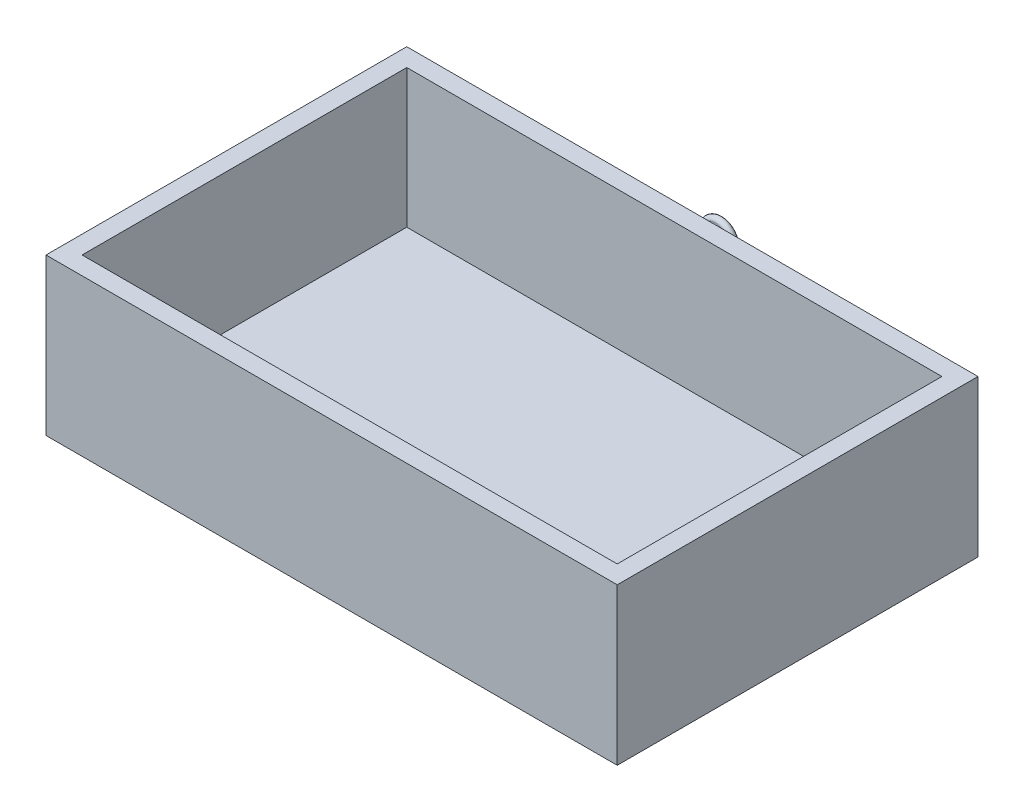
ISO-10303-21;
HEADER;
FILE_DESCRIPTION(('STEP AP214'),'2;1');
FILE_NAME('part.step','',(''),(''),'','','');
FILE_SCHEMA(('AUTOMOTIVE_DESIGN { 1 0 10303 214 1 1 1 1 }'));
ENDSEC;
DATA;
#1=APPLICATION_CONTEXT('core data for automotive mechanical design processes');
#2=APPLICATION_PROTOCOL_DEFINITION('international standard','automotive_design',2000,#1);
#3=PRODUCT_CONTEXT('',#1,'mechanical');
#4=PRODUCT('Part','Part','',(#3));
#5=PRODUCT_RELATED_PRODUCT_CATEGORY('part','',(#4));
#6=PRODUCT_DEFINITION_FORMATION('','',#4);
#7=PRODUCT_DEFINITION_CONTEXT('part definition',#1,'design');
#8=PRODUCT_DEFINITION('design','',#6,#7);
#9=PRODUCT_DEFINITION_SHAPE('','',#8);
#10=(LENGTH_UNIT() NAMED_UNIT(*) SI_UNIT(.MILLI.,.METRE.));
#11=(NAMED_UNIT(*) PLANE_ANGLE_UNIT() SI_UNIT($,.RADIAN.));
#12=(NAMED_UNIT(*) SI_UNIT($,.STERADIAN.) SOLID_ANGLE_UNIT());
#13=UNCERTAINTY_MEASURE_WITH_UNIT(LENGTH_MEASURE(1.E-05),#10,'distance_accuracy_value','');
#14=(GEOMETRIC_REPRESENTATION_CONTEXT(3) GLOBAL_UNCERTAINTY_ASSIGNED_CONTEXT((#13)) GLOBAL_UNIT_ASSIGNED_CONTEXT((#10,
#11,#12)) REPRESENTATION_CONTEXT('',''));
#15=CARTESIAN_POINT('',(0.,0.,0.));
#16=DIRECTION('',(0.,0.,1.));
#17=DIRECTION('',(1.,0.,0.));
#18=AXIS2_PLACEMENT_3D('',#15,#16,#17);
#19=CARTESIAN_POINT('',(-50.5555555555555,119.744444444445,300.));
#20=DIRECTION('',(0.,-1.,0.));
#21=DIRECTION('',(0.,0.,-1.));
#22=AXIS2_PLACEMENT_3D('',#19,#20,#21);
#23=PLANE('',#22);
#24=DIRECTION('',(-1.,0.,0.));
#25=VECTOR('',#24,1.);
#26=CARTESIAN_POINT('',(-50.5555555555555,119.744444444445,0.));
#27=LINE('',#26,#25);
#28=CARTESIAN_POINT('',(424.444444444444,119.744444444445,0.));
#29=VERTEX_POINT('',#28);
#30=CARTESIAN_POINT('',(-50.5555555555555,119.744444444445,0.));
#31=VERTEX_POINT('',#30);
#32=EDGE_CURVE('E85',#29,#31,#27,.T.);
#33=ORIENTED_EDGE('',*,*,#32,.T.);
#34=DIRECTION('',(0.,0.,-1.));
#35=VECTOR('',#34,1.);
#36=CARTESIAN_POINT('',(-50.5555555555555,119.744444444445,300.));
#37=LINE('',#36,#35);
#38=CARTESIAN_POINT('',(-50.5555555555555,119.744444444445,300.));
#39=VERTEX_POINT('',#38);
#40=EDGE_CURVE('E170',#39,#31,#37,.T.);
#41=ORIENTED_EDGE('',*,*,#40,.F.);
#42=DIRECTION('',(-1.,0.,0.));
#43=VECTOR('',#42,1.);
#44=CARTESIAN_POINT('',(-50.5555555555555,119.744444444445,300.));
#45=LINE('',#44,#43);
#46=CARTESIAN_POINT('',(424.444444444444,119.744444444445,300.));
#47=VERTEX_POINT('',#46);
#48=EDGE_CURVE('E64',#47,#39,#45,.T.);
#49=ORIENTED_EDGE('',*,*,#48,.F.);
#50=DIRECTION('',(0.,0.,-1.));
#51=VECTOR('',#50,1.);
#52=CARTESIAN_POINT('',(424.444444444444,119.744444444445,300.));
#53=LINE('',#52,#51);
#54=EDGE_CURVE('E185',#47,#29,#53,.T.);
#55=ORIENTED_EDGE('',*,*,#54,.T.);
#56=EDGE_LOOP('',(#33,#41,#49,#55));
#57=FACE_BOUND('',#56,.T.);
#58=DIRECTION('',(-1.,0.,0.));
#59=VECTOR('',#58,1.);
#60=CARTESIAN_POINT('',(0.,119.744444444445,15.));
#61=LINE('',#60,#59);
#62=CARTESIAN_POINT('',(409.444444444444,119.744444444445,15.));
#63=VERTEX_POINT('',#62);
#64=CARTESIAN_POINT('',(-35.5555555555555,119.744444444445,15.));
#65=VERTEX_POINT('',#64);
#66=EDGE_CURVE('E142',#63,#65,#61,.T.);
#67=ORIENTED_EDGE('',*,*,#66,.F.);
#68=DIRECTION('',(0.,0.,-1.));
#69=VECTOR('',#68,1.);
#70=CARTESIAN_POINT('',(409.444444444444,119.744444444445,300.));
#71=LINE('',#70,#69);
#72=CARTESIAN_POINT('',(409.444444444444,119.744444444445,285.));
#73=VERTEX_POINT('',#72);
#74=EDGE_CURVE('E136',#73,#63,#71,.T.);
#75=ORIENTED_EDGE('',*,*,#74,.F.);
#76=DIRECTION('',(-1.,0.,0.));
#77=VECTOR('',#76,1.);
#78=CARTESIAN_POINT('',(0.,119.744444444445,285.));
#79=LINE('',#78,#77);
#80=CARTESIAN_POINT('',(-35.5555555555555,119.744444444445,285.));
#81=VERTEX_POINT('',#80);
#82=EDGE_CURVE('E55',#73,#81,#79,.T.);
#83=ORIENTED_EDGE('',*,*,#82,.T.);
#84=DIRECTION('',(0.,0.,-1.));
#85=VECTOR('',#84,1.);
#86=CARTESIAN_POINT('',(-35.5555555555555,119.744444444444,300.));
#87=LINE('',#86,#85);
#88=EDGE_CURVE('E152',#81,#65,#87,.T.);
#89=ORIENTED_EDGE('',*,*,#88,.T.);
#90=EDGE_LOOP('',(#67,#75,#83,#89));
#91=FACE_BOUND('',#90,.T.);
#92=ADVANCED_FACE('F39',(#57,#91),#23,.F.);
#93=CARTESIAN_POINT('',(-50.5555555555555,-10.2555555555556,300.));
#94=DIRECTION('',(1.,0.,0.));
#95=DIRECTION('',(0.,1.,0.));
#96=AXIS2_PLACEMENT_3D('',#93,#94,#95);
#97=PLANE('',#96);
#98=DIRECTION('',(0.,-1.,0.));
#99=VECTOR('',#98,1.);
#100=CARTESIAN_POINT('',(-50.5555555555555,-10.2555555555556,0.));
#101=LINE('',#100,#99);
#102=CARTESIAN_POINT('',(-50.5555555555555,-10.2555555555556,0.));
#103=VERTEX_POINT('',#102);
#104=EDGE_CURVE('E171',#31,#103,#101,.T.);
#105=ORIENTED_EDGE('',*,*,#104,.T.);
#106=DIRECTION('',(0.,0.,-1.));
#107=VECTOR('',#106,1.);
#108=CARTESIAN_POINT('',(-50.5555555555555,-10.2555555555556,300.));
#109=LINE('',#108,#107);
#110=CARTESIAN_POINT('',(-50.5555555555555,-10.2555555555556,300.));
#111=VERTEX_POINT('',#110);
#112=EDGE_CURVE('E48',#111,#103,#109,.T.);
#113=ORIENTED_EDGE('',*,*,#112,.F.);
#114=DIRECTION('',(0.,-1.,0.));
#115=VECTOR('',#114,1.);
#116=CARTESIAN_POINT('',(-50.5555555555555,-10.2555555555556,300.));
#117=LINE('',#116,#115);
#118=EDGE_CURVE('E160',#39,#111,#117,.T.);
#119=ORIENTED_EDGE('',*,*,#118,.F.);
#120=ORIENTED_EDGE('',*,*,#40,.T.);
#121=EDGE_LOOP('',(#105,#113,#119,#120));
#122=FACE_BOUND('',#121,.T.);
#123=ADVANCED_FACE('F41',(#122),#97,.F.);
#124=CARTESIAN_POINT('',(424.444444444444,-10.2555555555555,300.));
#125=DIRECTION('',(0.,1.,0.));
#126=DIRECTION('',(-1.,0.,0.));
#127=AXIS2_PLACEMENT_3D('',#124,#125,#126);
#128=PLANE('',#127);
#129=DIRECTION('',(1.,0.,0.));
#130=VECTOR('',#129,1.);
#131=CARTESIAN_POINT('',(424.444444444444,-10.2555555555555,0.));
#132=LINE('',#131,#130);
#133=CARTESIAN_POINT('',(424.444444444444,-10.2555555555555,0.));
#134=VERTEX_POINT('',#133);
#135=EDGE_CURVE('E175',#103,#134,#132,.T.);
#136=ORIENTED_EDGE('',*,*,#135,.T.);
#137=DIRECTION('',(0.,0.,-1.));
#138=VECTOR('',#137,1.);
#139=CARTESIAN_POINT('',(424.444444444444,-10.2555555555555,300.));
#140=LINE('',#139,#138);
#141=CARTESIAN_POINT('',(424.444444444444,-10.2555555555555,300.));
#142=VERTEX_POINT('',#141);
#143=EDGE_CURVE('E188',#142,#134,#140,.T.);
#144=ORIENTED_EDGE('',*,*,#143,.F.);
#145=DIRECTION('',(1.,0.,0.));
#146=VECTOR('',#145,1.);
#147=CARTESIAN_POINT('',(424.444444444444,-10.2555555555555,300.));
#148=LINE('',#147,#146);
#149=EDGE_CURVE('E93',#111,#142,#148,.T.);
#150=ORIENTED_EDGE('',*,*,#149,.F.);
#151=ORIENTED_EDGE('',*,*,#112,.T.);
#152=EDGE_LOOP('',(#136,#144,#150,#151));
#153=FACE_BOUND('',#152,.T.);
#154=ADVANCED_FACE('F193',(#153),#128,.F.);
#155=CARTESIAN_POINT('',(424.444444444444,119.744444444445,300.));
#156=DIRECTION('',(-1.,0.,0.));
#157=DIRECTION('',(0.,0.,1.));
#158=AXIS2_PLACEMENT_3D('',#155,#156,#157);
#159=PLANE('',#158);
#160=DIRECTION('',(0.,1.,0.));
#161=VECTOR('',#160,1.);
#162=CARTESIAN_POINT('',(424.444444444444,119.744444444445,0.));
#163=LINE('',#162,#161);
#164=EDGE_CURVE('E178',#134,#29,#163,.T.);
#165=ORIENTED_EDGE('',*,*,#164,.T.);
#166=ORIENTED_EDGE('',*,*,#54,.F.);
#167=DIRECTION('',(0.,1.,0.));
#168=VECTOR('',#167,1.);
#169=CARTESIAN_POINT('',(424.444444444444,119.744444444445,300.));
#170=LINE('',#169,#168);
#171=EDGE_CURVE('E165',#142,#47,#170,.T.);
#172=ORIENTED_EDGE('',*,*,#171,.F.);
#173=ORIENTED_EDGE('',*,*,#143,.T.);
#174=EDGE_LOOP('',(#165,#166,#172,#173));
#175=FACE_BOUND('',#174,.T.);
#176=ADVANCED_FACE('F202',(#175),#159,.F.);
#177=CARTESIAN_POINT('',(0.,0.,300.));
#178=DIRECTION('',(0.,0.,-1.));
#179=DIRECTION('',(-1.,0.,0.));
#180=AXIS2_PLACEMENT_3D('',#177,#178,#179);
#181=PLANE('',#180);
#182=ORIENTED_EDGE('',*,*,#118,.T.);
#183=ORIENTED_EDGE('',*,*,#149,.T.);
#184=ORIENTED_EDGE('',*,*,#171,.T.);
#185=ORIENTED_EDGE('',*,*,#48,.T.);
#186=EDGE_LOOP('',(#182,#183,#184,#185));
#187=FACE_BOUND('',#186,.T.);
#188=ADVANCED_FACE('F205',(#187),#181,.F.);
#189=CARTESIAN_POINT('',(0.,0.,0.));
#190=DIRECTION('',(0.,0.,-1.));
#191=DIRECTION('',(-1.,0.,0.));
#192=AXIS2_PLACEMENT_3D('',#189,#190,#191);
#193=PLANE('',#192);
#194=CARTESIAN_POINT('',(186.944444444444,89.7444444444444,0.));
#195=DIRECTION('',(0.,0.,-1.));
#196=DIRECTION('',(-1.,0.,0.));
#197=AXIS2_PLACEMENT_3D('',#194,#195,#196);
#198=CIRCLE('',#197,7.37026980211881);
#199=CARTESIAN_POINT('',(179.574174642326,89.7444444444444,0.));
#200=VERTEX_POINT('',#199);
#201=EDGE_CURVE('E11',#200,#200,#198,.T.);
#202=ORIENTED_EDGE('',*,*,#201,.F.);
#203=EDGE_LOOP('',(#202));
#204=FACE_BOUND('',#203,.T.);
#205=ORIENTED_EDGE('',*,*,#104,.F.);
#206=ORIENTED_EDGE('',*,*,#32,.F.);
#207=ORIENTED_EDGE('',*,*,#164,.F.);
#208=ORIENTED_EDGE('',*,*,#135,.F.);
#209=EDGE_LOOP('',(#205,#206,#207,#208));
#210=FACE_BOUND('',#209,.T.);
#211=ADVANCED_FACE('F198',(#204,#210),#193,.T.);
#212=CARTESIAN_POINT('',(-35.5555555555555,-10.2555555555556,300.));
#213=DIRECTION('',(1.,0.,0.));
#214=DIRECTION('',(0.,1.,0.));
#215=AXIS2_PLACEMENT_3D('',#212,#213,#214);
#216=PLANE('',#215);
#217=DIRECTION('',(0.,-1.,0.));
#218=VECTOR('',#217,1.);
#219=CARTESIAN_POINT('',(-35.5555555555555,0.,15.));
#220=LINE('',#219,#218);
#221=CARTESIAN_POINT('',(-35.5555555555555,4.74444444444444,15.));
#222=VERTEX_POINT('',#221);
#223=EDGE_CURVE('E123',#65,#222,#220,.T.);
#224=ORIENTED_EDGE('',*,*,#223,.F.);
#225=ORIENTED_EDGE('',*,*,#88,.F.);
#226=DIRECTION('',(0.,-1.,0.));
#227=VECTOR('',#226,1.);
#228=CARTESIAN_POINT('',(-35.5555555555555,0.,285.));
#229=LINE('',#228,#227);
#230=CARTESIAN_POINT('',(-35.5555555555555,4.74444444444444,285.));
#231=VERTEX_POINT('',#230);
#232=EDGE_CURVE('E145',#81,#231,#229,.T.);
#233=ORIENTED_EDGE('',*,*,#232,.T.);
#234=DIRECTION('',(0.,0.,-1.));
#235=VECTOR('',#234,1.);
#236=CARTESIAN_POINT('',(-35.5555555555556,4.74444444444444,300.));
#237=LINE('',#236,#235);
#238=EDGE_CURVE('E135',#231,#222,#237,.T.);
#239=ORIENTED_EDGE('',*,*,#238,.T.);
#240=EDGE_LOOP('',(#224,#225,#233,#239));
#241=FACE_BOUND('',#240,.T.);
#242=ADVANCED_FACE('F212',(#241),#216,.T.);
#243=CARTESIAN_POINT('',(424.444444444444,4.7444444444445,300.));
#244=DIRECTION('',(0.,1.,0.));
#245=DIRECTION('',(-1.,0.,0.));
#246=AXIS2_PLACEMENT_3D('',#243,#244,#245);
#247=PLANE('',#246);
#248=DIRECTION('',(1.,0.,0.));
#249=VECTOR('',#248,1.);
#250=CARTESIAN_POINT('',(0.,4.74444444444445,15.));
#251=LINE('',#250,#249);
#252=CARTESIAN_POINT('',(409.444444444444,4.7444444444445,15.));
#253=VERTEX_POINT('',#252);
#254=EDGE_CURVE('E116',#222,#253,#251,.T.);
#255=ORIENTED_EDGE('',*,*,#254,.F.);
#256=ORIENTED_EDGE('',*,*,#238,.F.);
#257=DIRECTION('',(1.,0.,0.));
#258=VECTOR('',#257,1.);
#259=CARTESIAN_POINT('',(0.,4.74444444444445,285.));
#260=LINE('',#259,#258);
#261=CARTESIAN_POINT('',(409.444444444444,4.7444444444445,285.));
#262=VERTEX_POINT('',#261);
#263=EDGE_CURVE('E132',#231,#262,#260,.T.);
#264=ORIENTED_EDGE('',*,*,#263,.T.);
#265=DIRECTION('',(0.,0.,-1.));
#266=VECTOR('',#265,1.);
#267=CARTESIAN_POINT('',(409.444444444444,4.7444444444445,300.));
#268=LINE('',#267,#266);
#269=EDGE_CURVE('E130',#262,#253,#268,.T.);
#270=ORIENTED_EDGE('',*,*,#269,.T.);
#271=EDGE_LOOP('',(#255,#256,#264,#270));
#272=FACE_BOUND('',#271,.T.);
#273=ADVANCED_FACE('F131',(#272),#247,.T.);
#274=CARTESIAN_POINT('',(409.444444444444,119.744444444445,300.));
#275=DIRECTION('',(-1.,0.,0.));
#276=DIRECTION('',(0.,0.,1.));
#277=AXIS2_PLACEMENT_3D('',#274,#275,#276);
#278=PLANE('',#277);
#279=DIRECTION('',(0.,1.,0.));
#280=VECTOR('',#279,1.);
#281=CARTESIAN_POINT('',(409.444444444444,0.,15.));
#282=LINE('',#281,#280);
#283=EDGE_CURVE('E120',#253,#63,#282,.T.);
#284=ORIENTED_EDGE('',*,*,#283,.F.);
#285=ORIENTED_EDGE('',*,*,#269,.F.);
#286=DIRECTION('',(0.,1.,0.));
#287=VECTOR('',#286,1.);
#288=CARTESIAN_POINT('',(409.444444444444,0.,285.));
#289=LINE('',#288,#287);
#290=EDGE_CURVE('E149',#262,#73,#289,.T.);
#291=ORIENTED_EDGE('',*,*,#290,.T.);
#292=ORIENTED_EDGE('',*,*,#74,.T.);
#293=EDGE_LOOP('',(#284,#285,#291,#292));
#294=FACE_BOUND('',#293,.T.);
#295=ADVANCED_FACE('F138',(#294),#278,.T.);
#296=CARTESIAN_POINT('',(0.,0.,285.));
#297=DIRECTION('',(0.,0.,-1.));
#298=DIRECTION('',(-1.,0.,0.));
#299=AXIS2_PLACEMENT_3D('',#296,#297,#298);
#300=PLANE('',#299);
#301=ORIENTED_EDGE('',*,*,#232,.F.);
#302=ORIENTED_EDGE('',*,*,#82,.F.);
#303=ORIENTED_EDGE('',*,*,#290,.F.);
#304=ORIENTED_EDGE('',*,*,#263,.F.);
#305=EDGE_LOOP('',(#301,#302,#303,#304));
#306=FACE_BOUND('',#305,.T.);
#307=ADVANCED_FACE('F266',(#306),#300,.T.);
#308=CARTESIAN_POINT('',(0.,0.,15.));
#309=DIRECTION('',(0.,0.,-1.));
#310=DIRECTION('',(-1.,0.,0.));
#311=AXIS2_PLACEMENT_3D('',#308,#309,#310);
#312=PLANE('',#311);
#313=ORIENTED_EDGE('',*,*,#223,.T.);
#314=ORIENTED_EDGE('',*,*,#254,.T.);
#315=ORIENTED_EDGE('',*,*,#283,.T.);
#316=ORIENTED_EDGE('',*,*,#66,.T.);
#317=EDGE_LOOP('',(#313,#314,#315,#316));
#318=FACE_BOUND('',#317,.T.);
#319=ADVANCED_FACE('F118',(#318),#312,.F.);
#320=CARTESIAN_POINT('',(186.944444444444,89.7444444444444,-25.));
#321=DIRECTION('',(0.,0.,-1.));
#322=DIRECTION('',(-1.,0.,0.));
#323=AXIS2_PLACEMENT_3D('',#320,#321,#322);
#324=PLANE('',#323);
#325=CARTESIAN_POINT('',(186.944444444444,89.7444444444444,-25.));
#326=DIRECTION('',(0.,0.,1.));
#327=DIRECTION('',(1.,0.,0.));
#328=AXIS2_PLACEMENT_3D('',#325,#326,#327);
#329=CIRCLE('',#328,12.3702698021188);
#330=CARTESIAN_POINT('',(199.314714246563,89.7444444444444,-25.));
#331=VERTEX_POINT('',#330);
#332=EDGE_CURVE('E341',#331,#331,#329,.T.);
#333=ORIENTED_EDGE('',*,*,#332,.F.);
#334=EDGE_LOOP('',(#333));
#335=FACE_BOUND('',#334,.T.);
#336=ADVANCED_FACE('F283',(#335),#324,.T.);
#337=CARTESIAN_POINT('',(186.944444444444,89.7444444444444,-22.));
#338=DIRECTION('',(0.,0.,1.));
#339=DIRECTION('',(1.,0.,0.));
#340=AXIS2_PLACEMENT_3D('',#337,#338,#339);
#341=TOROIDAL_SURFACE('',#340,12.3702698021188,3.);
#342=ORIENTED_EDGE('',*,*,#332,.T.);
#343=EDGE_LOOP('',(#342));
#344=FACE_BOUND('',#343,.T.);
#345=CARTESIAN_POINT('',(186.944444444444,89.7444444444444,-19.));
#346=DIRECTION('',(0.,0.,1.));
#347=DIRECTION('',(1.,0.,0.));
#348=AXIS2_PLACEMENT_3D('',#345,#346,#347);
#349=CIRCLE('',#348,12.3702698021188);
#350=CARTESIAN_POINT('',(199.314714246563,89.7444444444444,-19.));
#351=VERTEX_POINT('',#350);
#352=EDGE_CURVE('E337',#351,#351,#349,.T.);
#353=ORIENTED_EDGE('',*,*,#352,.F.);
#354=EDGE_LOOP('',(#353));
#355=FACE_BOUND('',#354,.T.);
#356=ADVANCED_FACE('F296',(#344,#355),#341,.T.);
#357=CARTESIAN_POINT('',(186.944444444444,89.7444444444444,-14.));
#358=DIRECTION('',(0.,0.,1.));
#359=DIRECTION('',(1.,0.,0.));
#360=AXIS2_PLACEMENT_3D('',#357,#358,#359);
#361=TOROIDAL_SURFACE('',#360,12.3702698021188,5.);
#362=ORIENTED_EDGE('',*,*,#352,.T.);
#363=EDGE_LOOP('',(#362));
#364=FACE_BOUND('',#363,.T.);
#365=CARTESIAN_POINT('',(186.944444444444,89.7444444444444,-14.));
#366=DIRECTION('',(0.,0.,1.));
#367=DIRECTION('',(1.,0.,0.));
#368=AXIS2_PLACEMENT_3D('',#365,#366,#367);
#369=CIRCLE('',#368,7.37026980211881);
#370=CARTESIAN_POINT('',(194.314714246563,89.7444444444444,-14.));
#371=VERTEX_POINT('',#370);
#372=EDGE_CURVE('E333',#371,#371,#369,.T.);
#373=ORIENTED_EDGE('',*,*,#372,.F.);
#374=EDGE_LOOP('',(#373));
#375=FACE_BOUND('',#374,.T.);
#376=ADVANCED_FACE('F306',(#364,#375),#361,.F.);
#377=CARTESIAN_POINT('',(186.944444444444,89.7444444444444,0.));
#378=DIRECTION('',(0.,0.,1.));
#379=DIRECTION('',(1.,0.,0.));
#380=AXIS2_PLACEMENT_3D('',#377,#378,#379);
#381=CYLINDRICAL_SURFACE('',#380,7.37026980211881);
#382=ORIENTED_EDGE('',*,*,#372,.T.);
#383=EDGE_LOOP('',(#382));
#384=FACE_BOUND('',#383,.T.);
#385=ORIENTED_EDGE('',*,*,#201,.T.);
#386=EDGE_LOOP('',(#385));
#387=FACE_BOUND('',#386,.T.);
#388=ADVANCED_FACE('F316',(#384,#387),#381,.T.);
#389=CLOSED_SHELL('',(#92,#123,#154,#176,#188,#211,#242,#273,#295,#307,#319,#336,#356,#376,#388));
#390=MANIFOLD_SOLID_BREP('B2',#389);
#391=ADVANCED_BREP_SHAPE_REPRESENTATION('',(#18,#390),#14);
#392=SHAPE_DEFINITION_REPRESENTATION(#9,#391);
ENDSEC;
END-ISO-10303-21;
